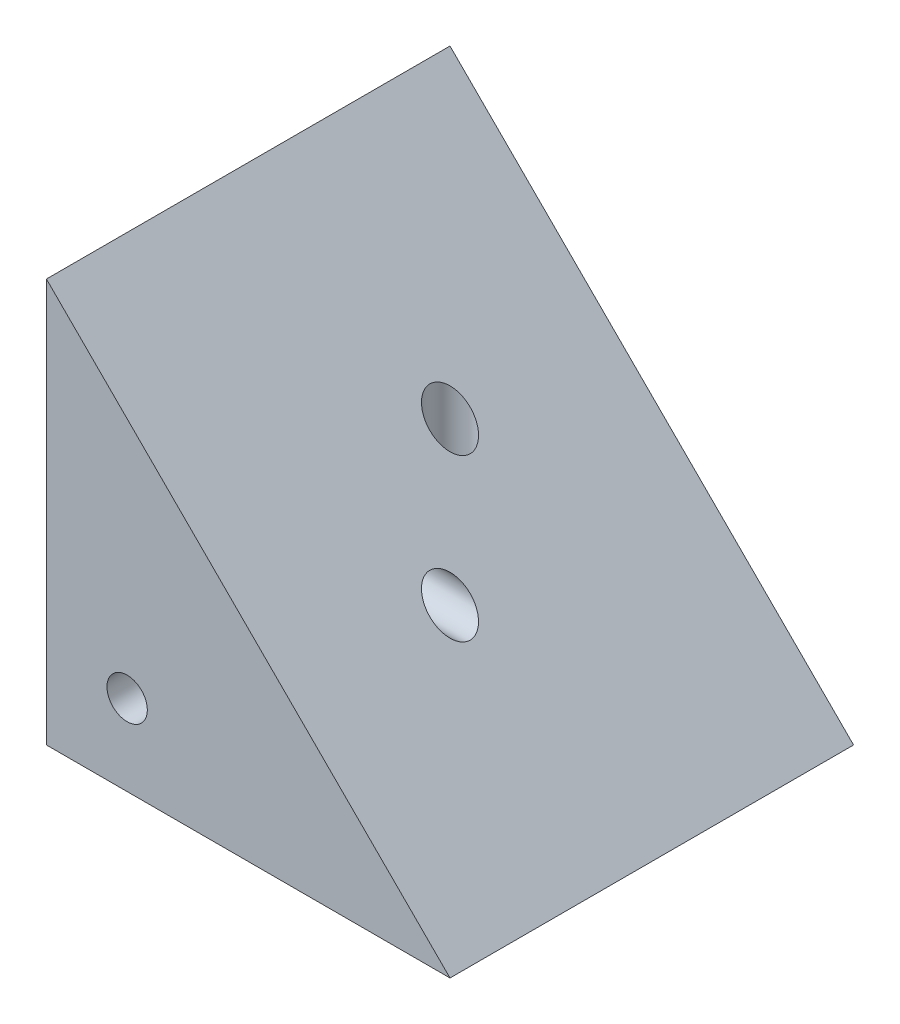
ISO-10303-21;
HEADER;
FILE_DESCRIPTION(('STEP AP214'),'2;1');
FILE_NAME('part.step','',(''),(''),'','','');
FILE_SCHEMA(('AUTOMOTIVE_DESIGN { 1 0 10303 214 1 1 1 1 }'));
ENDSEC;
DATA;
#1=APPLICATION_CONTEXT('core data for automotive mechanical design processes');
#2=APPLICATION_PROTOCOL_DEFINITION('international standard','automotive_design',2000,#1);
#3=PRODUCT_CONTEXT('',#1,'mechanical');
#4=PRODUCT('Part','Part','',(#3));
#5=PRODUCT_RELATED_PRODUCT_CATEGORY('part','',(#4));
#6=PRODUCT_DEFINITION_FORMATION('','',#4);
#7=PRODUCT_DEFINITION_CONTEXT('part definition',#1,'design');
#8=PRODUCT_DEFINITION('design','',#6,#7);
#9=PRODUCT_DEFINITION_SHAPE('','',#8);
#10=(LENGTH_UNIT() NAMED_UNIT(*) SI_UNIT(.MILLI.,.METRE.));
#11=(NAMED_UNIT(*) PLANE_ANGLE_UNIT() SI_UNIT($,.RADIAN.));
#12=(NAMED_UNIT(*) SI_UNIT($,.STERADIAN.) SOLID_ANGLE_UNIT());
#13=UNCERTAINTY_MEASURE_WITH_UNIT(LENGTH_MEASURE(1.E-05),#10,'distance_accuracy_value','');
#14=(GEOMETRIC_REPRESENTATION_CONTEXT(3) GLOBAL_UNCERTAINTY_ASSIGNED_CONTEXT((#13)) GLOBAL_UNIT_ASSIGNED_CONTEXT((#10,
#11,#12)) REPRESENTATION_CONTEXT('',''));
#15=CARTESIAN_POINT('',(0.,0.,0.));
#16=DIRECTION('',(0.,0.,1.));
#17=DIRECTION('',(1.,0.,0.));
#18=AXIS2_PLACEMENT_3D('',#15,#16,#17);
#19=CARTESIAN_POINT('',(0.,0.,25.));
#20=DIRECTION('',(0.,0.,-1.));
#21=DIRECTION('',(-1.,0.,0.));
#22=AXIS2_PLACEMENT_3D('',#19,#20,#21);
#23=PLANE('',#22);
#24=DIRECTION('',(1.,0.,0.));
#25=VECTOR('',#24,1.);
#26=CARTESIAN_POINT('',(25.,0.,25.));
#27=LINE('',#26,#25);
#28=CARTESIAN_POINT('',(0.,0.,25.));
#29=VERTEX_POINT('',#28);
#30=CARTESIAN_POINT('',(25.,0.,25.));
#31=VERTEX_POINT('',#30);
#32=EDGE_CURVE('E76',#29,#31,#27,.T.);
#33=ORIENTED_EDGE('',*,*,#32,.T.);
#34=DIRECTION('',(-0.707106781186547,0.707106781186547,0.));
#35=VECTOR('',#34,1.);
#36=CARTESIAN_POINT('',(0.,25.,25.));
#37=LINE('',#36,#35);
#38=CARTESIAN_POINT('',(0.,25.,25.));
#39=VERTEX_POINT('',#38);
#40=EDGE_CURVE('E72',#31,#39,#37,.T.);
#41=ORIENTED_EDGE('',*,*,#40,.T.);
#42=DIRECTION('',(0.,-1.,0.));
#43=VECTOR('',#42,1.);
#44=CARTESIAN_POINT('',(0.,0.,25.));
#45=LINE('',#44,#43);
#46=EDGE_CURVE('E52',#39,#29,#45,.T.);
#47=ORIENTED_EDGE('',*,*,#46,.T.);
#48=EDGE_LOOP('',(#33,#41,#47));
#49=FACE_BOUND('',#48,.T.);
#50=CARTESIAN_POINT('',(5.,5.,25.));
#51=DIRECTION('',(0.,0.,1.));
#52=DIRECTION('',(1.,0.,0.));
#53=AXIS2_PLACEMENT_3D('',#50,#51,#52);
#54=CIRCLE('',#53,1.25);
#55=CARTESIAN_POINT('',(6.25,5.,25.));
#56=VERTEX_POINT('',#55);
#57=EDGE_CURVE('E86',#56,#56,#54,.T.);
#58=ORIENTED_EDGE('',*,*,#57,.F.);
#59=EDGE_LOOP('',(#58));
#60=FACE_BOUND('',#59,.T.);
#61=ADVANCED_FACE('F34',(#49,#60),#23,.F.);
#62=CARTESIAN_POINT('',(0.,0.,0.));
#63=DIRECTION('',(0.,0.,-1.));
#64=DIRECTION('',(-1.,0.,0.));
#65=AXIS2_PLACEMENT_3D('',#62,#63,#64);
#66=PLANE('',#65);
#67=DIRECTION('',(1.,0.,0.));
#68=VECTOR('',#67,1.);
#69=CARTESIAN_POINT('',(25.,0.,0.));
#70=LINE('',#69,#68);
#71=CARTESIAN_POINT('',(0.,0.,0.));
#72=VERTEX_POINT('',#71);
#73=CARTESIAN_POINT('',(25.,0.,0.));
#74=VERTEX_POINT('',#73);
#75=EDGE_CURVE('E83',#72,#74,#70,.T.);
#76=ORIENTED_EDGE('',*,*,#75,.F.);
#77=DIRECTION('',(0.,-1.,0.));
#78=VECTOR('',#77,1.);
#79=CARTESIAN_POINT('',(0.,0.,0.));
#80=LINE('',#79,#78);
#81=CARTESIAN_POINT('',(0.,25.,0.));
#82=VERTEX_POINT('',#81);
#83=EDGE_CURVE('E69',#82,#72,#80,.T.);
#84=ORIENTED_EDGE('',*,*,#83,.F.);
#85=DIRECTION('',(-0.707106781186547,0.707106781186547,0.));
#86=VECTOR('',#85,1.);
#87=CARTESIAN_POINT('',(0.,25.,0.));
#88=LINE('',#87,#86);
#89=EDGE_CURVE('E64',#74,#82,#88,.T.);
#90=ORIENTED_EDGE('',*,*,#89,.F.);
#91=EDGE_LOOP('',(#76,#84,#90));
#92=FACE_BOUND('',#91,.T.);
#93=CARTESIAN_POINT('',(5.,5.,0.));
#94=DIRECTION('',(0.,0.,1.));
#95=DIRECTION('',(1.,0.,0.));
#96=AXIS2_PLACEMENT_3D('',#93,#94,#95);
#97=CIRCLE('',#96,1.25);
#98=CARTESIAN_POINT('',(6.25,5.,0.));
#99=VERTEX_POINT('',#98);
#100=EDGE_CURVE('E90',#99,#99,#97,.T.);
#101=ORIENTED_EDGE('',*,*,#100,.T.);
#102=EDGE_LOOP('',(#101));
#103=FACE_BOUND('',#102,.T.);
#104=ADVANCED_FACE('F97',(#92,#103),#66,.T.);
#105=CARTESIAN_POINT('',(25.,0.,25.));
#106=DIRECTION('',(0.,1.,0.));
#107=DIRECTION('',(-1.,0.,0.));
#108=AXIS2_PLACEMENT_3D('',#105,#106,#107);
#109=PLANE('',#108);
#110=CARTESIAN_POINT('',(10.,0.,10.));
#111=DIRECTION('',(0.,-1.,0.));
#112=DIRECTION('',(1.,0.,0.));
#113=AXIS2_PLACEMENT_3D('',#110,#111,#112);
#114=CIRCLE('',#113,1.25);
#115=CARTESIAN_POINT('',(11.25,0.,10.));
#116=VERTEX_POINT('',#115);
#117=EDGE_CURVE('E112',#116,#116,#114,.T.);
#118=ORIENTED_EDGE('',*,*,#117,.F.);
#119=EDGE_LOOP('',(#118));
#120=FACE_BOUND('',#119,.T.);
#121=ORIENTED_EDGE('',*,*,#75,.T.);
#122=DIRECTION('',(0.,0.,-1.));
#123=VECTOR('',#122,1.);
#124=CARTESIAN_POINT('',(25.,0.,25.));
#125=LINE('',#124,#123);
#126=EDGE_CURVE('E11',#31,#74,#125,.T.);
#127=ORIENTED_EDGE('',*,*,#126,.F.);
#128=ORIENTED_EDGE('',*,*,#32,.F.);
#129=DIRECTION('',(0.,0.,-1.));
#130=VECTOR('',#129,1.);
#131=CARTESIAN_POINT('',(0.,0.,25.));
#132=LINE('',#131,#130);
#133=EDGE_CURVE('E84',#29,#72,#132,.T.);
#134=ORIENTED_EDGE('',*,*,#133,.T.);
#135=EDGE_LOOP('',(#121,#127,#128,#134));
#136=FACE_BOUND('',#135,.T.);
#137=ADVANCED_FACE('F36',(#120,#136),#109,.F.);
#138=CARTESIAN_POINT('',(0.,25.,25.));
#139=DIRECTION('',(-0.707106781186547,-0.707106781186547,0.));
#140=DIRECTION('',(0.707106781186548,-0.707106781186548,0.));
#141=AXIS2_PLACEMENT_3D('',#138,#139,#140);
#142=PLANE('',#141);
#143=CARTESIAN_POINT('',(10.,15.,10.));
#144=DIRECTION('',(-0.707106781186547,-0.707106781186547,0.));
#145=DIRECTION('',(0.707106781186548,-0.707106781186548,0.));
#146=AXIS2_PLACEMENT_3D('',#143,#144,#145);
#147=ELLIPSE('',#146,1.76776695296637,1.25);
#148=CARTESIAN_POINT('',(11.25,13.75,10.));
#149=VERTEX_POINT('',#148);
#150=EDGE_CURVE('E38',#149,#149,#147,.T.);
#151=ORIENTED_EDGE('',*,*,#150,.T.);
#152=EDGE_LOOP('',(#151));
#153=FACE_BOUND('',#152,.T.);
#154=CARTESIAN_POINT('',(15.,10.,15.));
#155=DIRECTION('',(-0.707106781186547,-0.707106781186547,0.));
#156=DIRECTION('',(-0.707106781186548,0.707106781186548,0.));
#157=AXIS2_PLACEMENT_3D('',#154,#155,#156);
#158=ELLIPSE('',#157,1.76776695296637,1.25);
#159=CARTESIAN_POINT('',(13.75,11.25,15.));
#160=VERTEX_POINT('',#159);
#161=EDGE_CURVE('E104',#160,#160,#158,.T.);
#162=ORIENTED_EDGE('',*,*,#161,.T.);
#163=EDGE_LOOP('',(#162));
#164=FACE_BOUND('',#163,.T.);
#165=ORIENTED_EDGE('',*,*,#89,.T.);
#166=DIRECTION('',(0.,0.,-1.));
#167=VECTOR('',#166,1.);
#168=CARTESIAN_POINT('',(0.,25.,25.));
#169=LINE('',#168,#167);
#170=EDGE_CURVE('E44',#39,#82,#169,.T.);
#171=ORIENTED_EDGE('',*,*,#170,.F.);
#172=ORIENTED_EDGE('',*,*,#40,.F.);
#173=ORIENTED_EDGE('',*,*,#126,.T.);
#174=EDGE_LOOP('',(#165,#171,#172,#173));
#175=FACE_BOUND('',#174,.T.);
#176=ADVANCED_FACE('F73',(#153,#164,#175),#142,.F.);
#177=CARTESIAN_POINT('',(0.,0.,25.));
#178=DIRECTION('',(1.,0.,0.));
#179=DIRECTION('',(0.,0.,-1.));
#180=AXIS2_PLACEMENT_3D('',#177,#178,#179);
#181=PLANE('',#180);
#182=CARTESIAN_POINT('',(0.,10.,15.));
#183=DIRECTION('',(-1.,0.,0.));
#184=DIRECTION('',(0.,0.,1.));
#185=AXIS2_PLACEMENT_3D('',#182,#183,#184);
#186=CIRCLE('',#185,1.25);
#187=CARTESIAN_POINT('',(0.,10.,16.25));
#188=VERTEX_POINT('',#187);
#189=EDGE_CURVE('E107',#188,#188,#186,.T.);
#190=ORIENTED_EDGE('',*,*,#189,.F.);
#191=EDGE_LOOP('',(#190));
#192=FACE_BOUND('',#191,.T.);
#193=ORIENTED_EDGE('',*,*,#83,.T.);
#194=ORIENTED_EDGE('',*,*,#133,.F.);
#195=ORIENTED_EDGE('',*,*,#46,.F.);
#196=ORIENTED_EDGE('',*,*,#170,.T.);
#197=EDGE_LOOP('',(#193,#194,#195,#196));
#198=FACE_BOUND('',#197,.T.);
#199=ADVANCED_FACE('F96',(#192,#198),#181,.F.);
#200=CARTESIAN_POINT('',(5.,5.,25.));
#201=DIRECTION('',(0.,0.,-1.));
#202=DIRECTION('',(-1.,0.,0.));
#203=AXIS2_PLACEMENT_3D('',#200,#201,#202);
#204=CYLINDRICAL_SURFACE('',#203,1.25);
#205=ORIENTED_EDGE('',*,*,#57,.T.);
#206=EDGE_LOOP('',(#205));
#207=FACE_BOUND('',#206,.T.);
#208=ORIENTED_EDGE('',*,*,#100,.F.);
#209=EDGE_LOOP('',(#208));
#210=FACE_BOUND('',#209,.T.);
#211=ADVANCED_FACE('F128',(#207,#210),#204,.F.);
#212=CARTESIAN_POINT('',(25.,10.,15.));
#213=DIRECTION('',(-1.,0.,0.));
#214=DIRECTION('',(0.,0.,1.));
#215=AXIS2_PLACEMENT_3D('',#212,#213,#214);
#216=CYLINDRICAL_SURFACE('',#215,1.25);
#217=ORIENTED_EDGE('',*,*,#189,.T.);
#218=EDGE_LOOP('',(#217));
#219=FACE_BOUND('',#218,.T.);
#220=ORIENTED_EDGE('',*,*,#161,.F.);
#221=EDGE_LOOP('',(#220));
#222=FACE_BOUND('',#221,.T.);
#223=ADVANCED_FACE('F123',(#219,#222),#216,.F.);
#224=CARTESIAN_POINT('',(10.,25.,10.));
#225=DIRECTION('',(0.,-1.,0.));
#226=DIRECTION('',(1.,0.,0.));
#227=AXIS2_PLACEMENT_3D('',#224,#225,#226);
#228=CYLINDRICAL_SURFACE('',#227,1.25);
#229=ORIENTED_EDGE('',*,*,#117,.T.);
#230=EDGE_LOOP('',(#229));
#231=FACE_BOUND('',#230,.T.);
#232=ORIENTED_EDGE('',*,*,#150,.F.);
#233=EDGE_LOOP('',(#232));
#234=FACE_BOUND('',#233,.T.);
#235=ADVANCED_FACE('F121',(#231,#234),#228,.F.);
#236=CLOSED_SHELL('',(#61,#104,#137,#176,#199,#211,#223,#235));
#237=MANIFOLD_SOLID_BREP('B2',#236);
#238=ADVANCED_BREP_SHAPE_REPRESENTATION('',(#18,#237),#14);
#239=SHAPE_DEFINITION_REPRESENTATION(#9,#238);
ENDSEC;
END-ISO-10303-21;
